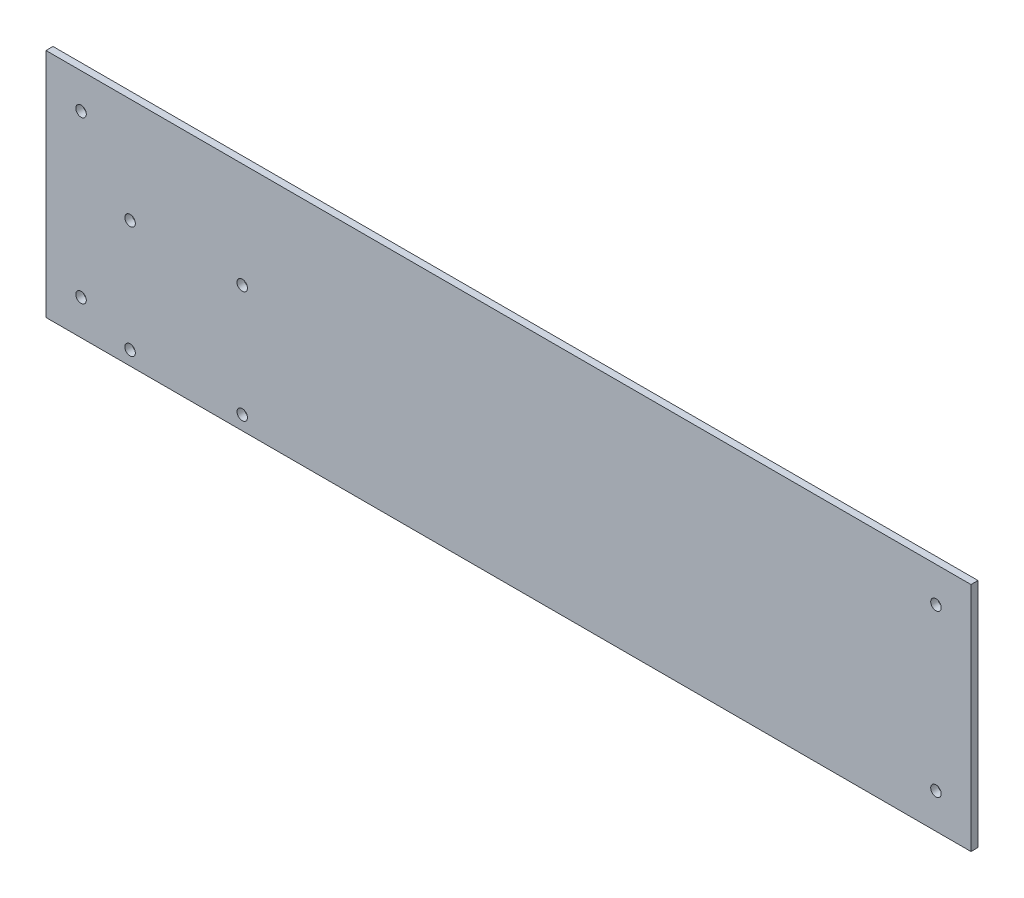
ISO-10303-21;
HEADER;
FILE_DESCRIPTION(('STEP AP214'),'2;1');
FILE_NAME('part.step','',(''),(''),'','','');
FILE_SCHEMA(('AUTOMOTIVE_DESIGN { 1 0 10303 214 1 1 1 1 }'));
ENDSEC;
DATA;
#1=APPLICATION_CONTEXT('core data for automotive mechanical design processes');
#2=APPLICATION_PROTOCOL_DEFINITION('international standard','automotive_design',2000,#1);
#3=PRODUCT_CONTEXT('',#1,'mechanical');
#4=PRODUCT('Part','Part','',(#3));
#5=PRODUCT_RELATED_PRODUCT_CATEGORY('part','',(#4));
#6=PRODUCT_DEFINITION_FORMATION('','',#4);
#7=PRODUCT_DEFINITION_CONTEXT('part definition',#1,'design');
#8=PRODUCT_DEFINITION('design','',#6,#7);
#9=PRODUCT_DEFINITION_SHAPE('','',#8);
#10=(LENGTH_UNIT() NAMED_UNIT(*) SI_UNIT(.MILLI.,.METRE.));
#11=(NAMED_UNIT(*) PLANE_ANGLE_UNIT() SI_UNIT($,.RADIAN.));
#12=(NAMED_UNIT(*) SI_UNIT($,.STERADIAN.) SOLID_ANGLE_UNIT());
#13=UNCERTAINTY_MEASURE_WITH_UNIT(LENGTH_MEASURE(1.E-05),#10,'distance_accuracy_value','');
#14=(GEOMETRIC_REPRESENTATION_CONTEXT(3) GLOBAL_UNCERTAINTY_ASSIGNED_CONTEXT((#13)) GLOBAL_UNIT_ASSIGNED_CONTEXT((#10,
#11,#12)) REPRESENTATION_CONTEXT('',''));
#15=CARTESIAN_POINT('',(0.,0.,0.));
#16=DIRECTION('',(0.,0.,1.));
#17=DIRECTION('',(1.,0.,0.));
#18=AXIS2_PLACEMENT_3D('',#15,#16,#17);
#19=CARTESIAN_POINT('',(-45.7386993125698,-13.0918085106383,2.));
#20=DIRECTION('',(0.,0.,1.));
#21=DIRECTION('',(1.,0.,0.));
#22=AXIS2_PLACEMENT_3D('',#19,#20,#21);
#23=PLANE('',#22);
#24=CARTESIAN_POINT('',(-21.7386993125698,-9.09180851063831,2.));
#25=DIRECTION('',(0.,0.,1.));
#26=DIRECTION('',(1.,0.,0.));
#27=AXIS2_PLACEMENT_3D('',#24,#25,#26);
#28=CIRCLE('',#27,1.5);
#29=CARTESIAN_POINT('',(-20.2386993125698,-9.09180851063831,2.));
#30=VERTEX_POINT('',#29);
#31=EDGE_CURVE('E126',#30,#30,#28,.T.);
#32=ORIENTED_EDGE('',*,*,#31,.F.);
#33=EDGE_LOOP('',(#32));
#34=FACE_BOUND('',#33,.T.);
#35=CARTESIAN_POINT('',(10.2613006874302,-9.0918085106383,2.));
#36=DIRECTION('',(0.,0.,1.));
#37=DIRECTION('',(1.,0.,0.));
#38=AXIS2_PLACEMENT_3D('',#35,#36,#37);
#39=CIRCLE('',#38,1.5);
#40=CARTESIAN_POINT('',(11.7613006874302,-9.0918085106383,2.));
#41=VERTEX_POINT('',#40);
#42=EDGE_CURVE('E116',#41,#41,#39,.T.);
#43=ORIENTED_EDGE('',*,*,#42,.F.);
#44=EDGE_LOOP('',(#43));
#45=FACE_BOUND('',#44,.T.);
#46=CARTESIAN_POINT('',(10.2613006874301,22.9081914893617,2.));
#47=DIRECTION('',(0.,0.,1.));
#48=DIRECTION('',(1.,0.,0.));
#49=AXIS2_PLACEMENT_3D('',#46,#47,#48);
#50=CIRCLE('',#49,1.5);
#51=CARTESIAN_POINT('',(11.7613006874302,22.9081914893617,2.));
#52=VERTEX_POINT('',#51);
#53=EDGE_CURVE('E113',#52,#52,#50,.T.);
#54=ORIENTED_EDGE('',*,*,#53,.F.);
#55=EDGE_LOOP('',(#54));
#56=FACE_BOUND('',#55,.T.);
#57=CARTESIAN_POINT('',(-21.7386993125699,22.9081914893617,2.));
#58=DIRECTION('',(0.,0.,1.));
#59=DIRECTION('',(1.,0.,0.));
#60=AXIS2_PLACEMENT_3D('',#57,#58,#59);
#61=CIRCLE('',#60,1.5);
#62=CARTESIAN_POINT('',(-20.2386993125698,22.9081914893617,2.));
#63=VERTEX_POINT('',#62);
#64=EDGE_CURVE('E110',#63,#63,#61,.T.);
#65=ORIENTED_EDGE('',*,*,#64,.F.);
#66=EDGE_LOOP('',(#65));
#67=FACE_BOUND('',#66,.T.);
#68=CARTESIAN_POINT('',(208.26130068743,42.9081914893617,2.));
#69=DIRECTION('',(0.,0.,1.));
#70=DIRECTION('',(1.,0.,0.));
#71=AXIS2_PLACEMENT_3D('',#68,#69,#70);
#72=CIRCLE('',#71,1.5);
#73=CARTESIAN_POINT('',(209.76130068743,42.9081914893617,2.));
#74=VERTEX_POINT('',#73);
#75=EDGE_CURVE('E137',#74,#74,#72,.T.);
#76=ORIENTED_EDGE('',*,*,#75,.F.);
#77=EDGE_LOOP('',(#76));
#78=FACE_BOUND('',#77,.T.);
#79=CARTESIAN_POINT('',(-35.7386993125698,42.9081914893617,2.));
#80=DIRECTION('',(0.,0.,1.));
#81=DIRECTION('',(1.,0.,0.));
#82=AXIS2_PLACEMENT_3D('',#79,#80,#81);
#83=CIRCLE('',#82,1.5);
#84=CARTESIAN_POINT('',(-34.2386993125698,42.9081914893617,2.));
#85=VERTEX_POINT('',#84);
#86=EDGE_CURVE('E100',#85,#85,#83,.T.);
#87=ORIENTED_EDGE('',*,*,#86,.F.);
#88=EDGE_LOOP('',(#87));
#89=FACE_BOUND('',#88,.T.);
#90=DIRECTION('',(0.,-1.,0.));
#91=VECTOR('',#90,1.);
#92=CARTESIAN_POINT('',(-45.7386993125698,52.9081914893617,2.));
#93=LINE('',#92,#91);
#94=CARTESIAN_POINT('',(-45.7386993125698,52.9081914893617,2.));
#95=VERTEX_POINT('',#94);
#96=CARTESIAN_POINT('',(-45.7386993125698,-13.0918085106383,2.));
#97=VERTEX_POINT('',#96);
#98=EDGE_CURVE('E84',#95,#97,#93,.T.);
#99=ORIENTED_EDGE('',*,*,#98,.T.);
#100=DIRECTION('',(1.,0.,0.));
#101=VECTOR('',#100,1.);
#102=CARTESIAN_POINT('',(-45.7386993125698,-13.0918085106383,2.));
#103=LINE('',#102,#101);
#104=CARTESIAN_POINT('',(218.26130068743,-13.0918085106383,2.));
#105=VERTEX_POINT('',#104);
#106=EDGE_CURVE('E79',#97,#105,#103,.T.);
#107=ORIENTED_EDGE('',*,*,#106,.T.);
#108=DIRECTION('',(0.,1.,0.));
#109=VECTOR('',#108,1.);
#110=CARTESIAN_POINT('',(218.26130068743,52.9081914893617,2.));
#111=LINE('',#110,#109);
#112=CARTESIAN_POINT('',(218.26130068743,52.9081914893617,2.));
#113=VERTEX_POINT('',#112);
#114=EDGE_CURVE('E82',#105,#113,#111,.T.);
#115=ORIENTED_EDGE('',*,*,#114,.T.);
#116=DIRECTION('',(-1.,0.,0.));
#117=VECTOR('',#116,1.);
#118=CARTESIAN_POINT('',(-45.7386993125698,52.9081914893617,2.));
#119=LINE('',#118,#117);
#120=EDGE_CURVE('E49',#113,#95,#119,.T.);
#121=ORIENTED_EDGE('',*,*,#120,.T.);
#122=EDGE_LOOP('',(#99,#107,#115,#121));
#123=FACE_BOUND('',#122,.T.);
#124=CARTESIAN_POINT('',(-35.7386993125698,-3.09180851063831,2.));
#125=DIRECTION('',(0.,0.,1.));
#126=DIRECTION('',(1.,0.,0.));
#127=AXIS2_PLACEMENT_3D('',#124,#125,#126);
#128=CIRCLE('',#127,1.5);
#129=CARTESIAN_POINT('',(-34.2386993125698,-3.09180851063831,2.));
#130=VERTEX_POINT('',#129);
#131=EDGE_CURVE('E143',#130,#130,#128,.T.);
#132=ORIENTED_EDGE('',*,*,#131,.F.);
#133=EDGE_LOOP('',(#132));
#134=FACE_BOUND('',#133,.T.);
#135=CARTESIAN_POINT('',(208.26130068743,-3.09180851063831,2.));
#136=DIRECTION('',(0.,0.,1.));
#137=DIRECTION('',(1.,0.,0.));
#138=AXIS2_PLACEMENT_3D('',#135,#136,#137);
#139=CIRCLE('',#138,1.5);
#140=CARTESIAN_POINT('',(209.76130068743,-3.09180851063831,2.));
#141=VERTEX_POINT('',#140);
#142=EDGE_CURVE('E131',#141,#141,#139,.T.);
#143=ORIENTED_EDGE('',*,*,#142,.F.);
#144=EDGE_LOOP('',(#143));
#145=FACE_BOUND('',#144,.T.);
#146=ADVANCED_FACE('F30',(#34,#45,#56,#67,#78,#89,#123,#134,#145),#23,.T.);
#147=CARTESIAN_POINT('',(-45.7386993125698,-13.0918085106383,0.));
#148=DIRECTION('',(0.,0.,1.));
#149=DIRECTION('',(1.,0.,0.));
#150=AXIS2_PLACEMENT_3D('',#147,#148,#149);
#151=PLANE('',#150);
#152=CARTESIAN_POINT('',(-21.7386993125698,-9.09180851063831,0.));
#153=DIRECTION('',(0.,0.,1.));
#154=DIRECTION('',(1.,0.,0.));
#155=AXIS2_PLACEMENT_3D('',#152,#153,#154);
#156=CIRCLE('',#155,1.5);
#157=CARTESIAN_POINT('',(-20.2386993125698,-9.09180851063831,0.));
#158=VERTEX_POINT('',#157);
#159=EDGE_CURVE('E34',#158,#158,#156,.T.);
#160=ORIENTED_EDGE('',*,*,#159,.T.);
#161=EDGE_LOOP('',(#160));
#162=FACE_BOUND('',#161,.T.);
#163=CARTESIAN_POINT('',(10.2613006874302,-9.0918085106383,0.));
#164=DIRECTION('',(0.,0.,1.));
#165=DIRECTION('',(1.,0.,0.));
#166=AXIS2_PLACEMENT_3D('',#163,#164,#165);
#167=CIRCLE('',#166,1.5);
#168=CARTESIAN_POINT('',(11.7613006874302,-9.0918085106383,0.));
#169=VERTEX_POINT('',#168);
#170=EDGE_CURVE('E114',#169,#169,#167,.T.);
#171=ORIENTED_EDGE('',*,*,#170,.T.);
#172=EDGE_LOOP('',(#171));
#173=FACE_BOUND('',#172,.T.);
#174=CARTESIAN_POINT('',(10.2613006874301,22.9081914893617,0.));
#175=DIRECTION('',(0.,0.,1.));
#176=DIRECTION('',(1.,0.,0.));
#177=AXIS2_PLACEMENT_3D('',#174,#175,#176);
#178=CIRCLE('',#177,1.5);
#179=CARTESIAN_POINT('',(11.7613006874302,22.9081914893617,0.));
#180=VERTEX_POINT('',#179);
#181=EDGE_CURVE('E111',#180,#180,#178,.T.);
#182=ORIENTED_EDGE('',*,*,#181,.T.);
#183=EDGE_LOOP('',(#182));
#184=FACE_BOUND('',#183,.T.);
#185=CARTESIAN_POINT('',(-21.7386993125699,22.9081914893617,0.));
#186=DIRECTION('',(0.,0.,1.));
#187=DIRECTION('',(1.,0.,0.));
#188=AXIS2_PLACEMENT_3D('',#185,#186,#187);
#189=CIRCLE('',#188,1.5);
#190=CARTESIAN_POINT('',(-20.2386993125698,22.9081914893617,0.));
#191=VERTEX_POINT('',#190);
#192=EDGE_CURVE('E106',#191,#191,#189,.T.);
#193=ORIENTED_EDGE('',*,*,#192,.T.);
#194=EDGE_LOOP('',(#193));
#195=FACE_BOUND('',#194,.T.);
#196=CARTESIAN_POINT('',(208.26130068743,42.9081914893617,0.));
#197=DIRECTION('',(0.,0.,1.));
#198=DIRECTION('',(1.,0.,0.));
#199=AXIS2_PLACEMENT_3D('',#196,#197,#198);
#200=CIRCLE('',#199,1.5);
#201=CARTESIAN_POINT('',(209.76130068743,42.9081914893617,0.));
#202=VERTEX_POINT('',#201);
#203=EDGE_CURVE('E134',#202,#202,#200,.T.);
#204=ORIENTED_EDGE('',*,*,#203,.T.);
#205=EDGE_LOOP('',(#204));
#206=FACE_BOUND('',#205,.T.);
#207=CARTESIAN_POINT('',(-35.7386993125698,42.9081914893617,0.));
#208=DIRECTION('',(0.,0.,1.));
#209=DIRECTION('',(1.,0.,0.));
#210=AXIS2_PLACEMENT_3D('',#207,#208,#209);
#211=CIRCLE('',#210,1.5);
#212=CARTESIAN_POINT('',(-34.2386993125698,42.9081914893617,0.));
#213=VERTEX_POINT('',#212);
#214=EDGE_CURVE('E146',#213,#213,#211,.T.);
#215=ORIENTED_EDGE('',*,*,#214,.T.);
#216=EDGE_LOOP('',(#215));
#217=FACE_BOUND('',#216,.T.);
#218=DIRECTION('',(0.,-1.,0.));
#219=VECTOR('',#218,1.);
#220=CARTESIAN_POINT('',(-45.7386993125698,52.9081914893617,0.));
#221=LINE('',#220,#219);
#222=CARTESIAN_POINT('',(-45.7386993125698,52.9081914893617,0.));
#223=VERTEX_POINT('',#222);
#224=CARTESIAN_POINT('',(-45.7386993125698,-13.0918085106383,0.));
#225=VERTEX_POINT('',#224);
#226=EDGE_CURVE('E97',#223,#225,#221,.T.);
#227=ORIENTED_EDGE('',*,*,#226,.F.);
#228=DIRECTION('',(-1.,0.,0.));
#229=VECTOR('',#228,1.);
#230=CARTESIAN_POINT('',(-45.7386993125698,52.9081914893617,0.));
#231=LINE('',#230,#229);
#232=CARTESIAN_POINT('',(218.26130068743,52.9081914893617,0.));
#233=VERTEX_POINT('',#232);
#234=EDGE_CURVE('E72',#233,#223,#231,.T.);
#235=ORIENTED_EDGE('',*,*,#234,.F.);
#236=DIRECTION('',(0.,1.,0.));
#237=VECTOR('',#236,1.);
#238=CARTESIAN_POINT('',(218.26130068743,52.9081914893617,0.));
#239=LINE('',#238,#237);
#240=CARTESIAN_POINT('',(218.26130068743,-13.0918085106383,0.));
#241=VERTEX_POINT('',#240);
#242=EDGE_CURVE('E66',#241,#233,#239,.T.);
#243=ORIENTED_EDGE('',*,*,#242,.F.);
#244=DIRECTION('',(1.,0.,0.));
#245=VECTOR('',#244,1.);
#246=CARTESIAN_POINT('',(-45.7386993125698,-13.0918085106383,0.));
#247=LINE('',#246,#245);
#248=EDGE_CURVE('E88',#225,#241,#247,.T.);
#249=ORIENTED_EDGE('',*,*,#248,.F.);
#250=EDGE_LOOP('',(#227,#235,#243,#249));
#251=FACE_BOUND('',#250,.T.);
#252=CARTESIAN_POINT('',(-35.7386993125698,-3.09180851063831,0.));
#253=DIRECTION('',(0.,0.,1.));
#254=DIRECTION('',(1.,0.,0.));
#255=AXIS2_PLACEMENT_3D('',#252,#253,#254);
#256=CIRCLE('',#255,1.5);
#257=CARTESIAN_POINT('',(-34.2386993125698,-3.09180851063831,0.));
#258=VERTEX_POINT('',#257);
#259=EDGE_CURVE('E140',#258,#258,#256,.T.);
#260=ORIENTED_EDGE('',*,*,#259,.T.);
#261=EDGE_LOOP('',(#260));
#262=FACE_BOUND('',#261,.T.);
#263=CARTESIAN_POINT('',(208.26130068743,-3.09180851063831,0.));
#264=DIRECTION('',(0.,0.,1.));
#265=DIRECTION('',(1.,0.,0.));
#266=AXIS2_PLACEMENT_3D('',#263,#264,#265);
#267=CIRCLE('',#266,1.5);
#268=CARTESIAN_POINT('',(209.76130068743,-3.09180851063831,0.));
#269=VERTEX_POINT('',#268);
#270=EDGE_CURVE('E109',#269,#269,#267,.T.);
#271=ORIENTED_EDGE('',*,*,#270,.T.);
#272=EDGE_LOOP('',(#271));
#273=FACE_BOUND('',#272,.T.);
#274=ADVANCED_FACE('F154',(#162,#173,#184,#195,#206,#217,#251,#262,#273),#151,.F.);
#275=CARTESIAN_POINT('',(-45.7386993125698,52.9081914893617,2.));
#276=DIRECTION('',(1.,0.,0.));
#277=DIRECTION('',(0.,0.,-1.));
#278=AXIS2_PLACEMENT_3D('',#275,#276,#277);
#279=PLANE('',#278);
#280=ORIENTED_EDGE('',*,*,#226,.T.);
#281=DIRECTION('',(0.,0.,-1.));
#282=VECTOR('',#281,1.);
#283=CARTESIAN_POINT('',(-45.7386993125698,-13.0918085106383,2.));
#284=LINE('',#283,#282);
#285=EDGE_CURVE('E11',#97,#225,#284,.T.);
#286=ORIENTED_EDGE('',*,*,#285,.F.);
#287=ORIENTED_EDGE('',*,*,#98,.F.);
#288=DIRECTION('',(0.,0.,-1.));
#289=VECTOR('',#288,1.);
#290=CARTESIAN_POINT('',(-45.7386993125698,52.9081914893617,2.));
#291=LINE('',#290,#289);
#292=EDGE_CURVE('E93',#95,#223,#291,.T.);
#293=ORIENTED_EDGE('',*,*,#292,.T.);
#294=EDGE_LOOP('',(#280,#286,#287,#293));
#295=FACE_BOUND('',#294,.T.);
#296=ADVANCED_FACE('F32',(#295),#279,.F.);
#297=CARTESIAN_POINT('',(-45.7386993125698,-13.0918085106383,2.));
#298=DIRECTION('',(0.,1.,0.));
#299=DIRECTION('',(0.,0.,1.));
#300=AXIS2_PLACEMENT_3D('',#297,#298,#299);
#301=PLANE('',#300);
#302=ORIENTED_EDGE('',*,*,#248,.T.);
#303=DIRECTION('',(0.,0.,-1.));
#304=VECTOR('',#303,1.);
#305=CARTESIAN_POINT('',(218.26130068743,-13.0918085106383,2.));
#306=LINE('',#305,#304);
#307=EDGE_CURVE('E40',#105,#241,#306,.T.);
#308=ORIENTED_EDGE('',*,*,#307,.F.);
#309=ORIENTED_EDGE('',*,*,#106,.F.);
#310=ORIENTED_EDGE('',*,*,#285,.T.);
#311=EDGE_LOOP('',(#302,#308,#309,#310));
#312=FACE_BOUND('',#311,.T.);
#313=ADVANCED_FACE('F87',(#312),#301,.F.);
#314=CARTESIAN_POINT('',(218.26130068743,52.9081914893617,2.));
#315=DIRECTION('',(-1.,0.,0.));
#316=DIRECTION('',(0.,0.,1.));
#317=AXIS2_PLACEMENT_3D('',#314,#315,#316);
#318=PLANE('',#317);
#319=ORIENTED_EDGE('',*,*,#242,.T.);
#320=DIRECTION('',(0.,0.,-1.));
#321=VECTOR('',#320,1.);
#322=CARTESIAN_POINT('',(218.26130068743,52.9081914893617,2.));
#323=LINE('',#322,#321);
#324=EDGE_CURVE('E89',#113,#233,#323,.T.);
#325=ORIENTED_EDGE('',*,*,#324,.F.);
#326=ORIENTED_EDGE('',*,*,#114,.F.);
#327=ORIENTED_EDGE('',*,*,#307,.T.);
#328=EDGE_LOOP('',(#319,#325,#326,#327));
#329=FACE_BOUND('',#328,.T.);
#330=ADVANCED_FACE('F91',(#329),#318,.F.);
#331=CARTESIAN_POINT('',(-45.7386993125698,52.9081914893617,2.));
#332=DIRECTION('',(0.,-1.,0.));
#333=DIRECTION('',(0.,0.,-1.));
#334=AXIS2_PLACEMENT_3D('',#331,#332,#333);
#335=PLANE('',#334);
#336=ORIENTED_EDGE('',*,*,#234,.T.);
#337=ORIENTED_EDGE('',*,*,#292,.F.);
#338=ORIENTED_EDGE('',*,*,#120,.F.);
#339=ORIENTED_EDGE('',*,*,#324,.T.);
#340=EDGE_LOOP('',(#336,#337,#338,#339));
#341=FACE_BOUND('',#340,.T.);
#342=ADVANCED_FACE('F160',(#341),#335,.F.);
#343=CARTESIAN_POINT('',(-35.7386993125698,42.9081914893617,2.));
#344=DIRECTION('',(0.,0.,-1.));
#345=DIRECTION('',(-1.,0.,0.));
#346=AXIS2_PLACEMENT_3D('',#343,#344,#345);
#347=CYLINDRICAL_SURFACE('',#346,1.5);
#348=ORIENTED_EDGE('',*,*,#86,.T.);
#349=EDGE_LOOP('',(#348));
#350=FACE_BOUND('',#349,.T.);
#351=ORIENTED_EDGE('',*,*,#214,.F.);
#352=EDGE_LOOP('',(#351));
#353=FACE_BOUND('',#352,.T.);
#354=ADVANCED_FACE('F157',(#350,#353),#347,.F.);
#355=CARTESIAN_POINT('',(-35.7386993125698,-3.09180851063831,2.));
#356=DIRECTION('',(0.,0.,-1.));
#357=DIRECTION('',(-1.,0.,0.));
#358=AXIS2_PLACEMENT_3D('',#355,#356,#357);
#359=CYLINDRICAL_SURFACE('',#358,1.5);
#360=ORIENTED_EDGE('',*,*,#131,.T.);
#361=EDGE_LOOP('',(#360));
#362=FACE_BOUND('',#361,.T.);
#363=ORIENTED_EDGE('',*,*,#259,.F.);
#364=EDGE_LOOP('',(#363));
#365=FACE_BOUND('',#364,.T.);
#366=ADVANCED_FACE('F159',(#362,#365),#359,.F.);
#367=CARTESIAN_POINT('',(208.26130068743,42.9081914893617,2.));
#368=DIRECTION('',(0.,0.,-1.));
#369=DIRECTION('',(-1.,0.,0.));
#370=AXIS2_PLACEMENT_3D('',#367,#368,#369);
#371=CYLINDRICAL_SURFACE('',#370,1.5);
#372=ORIENTED_EDGE('',*,*,#75,.T.);
#373=EDGE_LOOP('',(#372));
#374=FACE_BOUND('',#373,.T.);
#375=ORIENTED_EDGE('',*,*,#203,.F.);
#376=EDGE_LOOP('',(#375));
#377=FACE_BOUND('',#376,.T.);
#378=ADVANCED_FACE('F167',(#374,#377),#371,.F.);
#379=CARTESIAN_POINT('',(208.26130068743,-3.09180851063831,2.));
#380=DIRECTION('',(0.,0.,-1.));
#381=DIRECTION('',(-1.,0.,0.));
#382=AXIS2_PLACEMENT_3D('',#379,#380,#381);
#383=CYLINDRICAL_SURFACE('',#382,1.5);
#384=ORIENTED_EDGE('',*,*,#142,.T.);
#385=EDGE_LOOP('',(#384));
#386=FACE_BOUND('',#385,.T.);
#387=ORIENTED_EDGE('',*,*,#270,.F.);
#388=EDGE_LOOP('',(#387));
#389=FACE_BOUND('',#388,.T.);
#390=ADVANCED_FACE('F196',(#386,#389),#383,.F.);
#391=CARTESIAN_POINT('',(-21.7386993125699,22.9081914893617,-8.));
#392=DIRECTION('',(0.,0.,1.));
#393=DIRECTION('',(1.,0.,0.));
#394=AXIS2_PLACEMENT_3D('',#391,#392,#393);
#395=CYLINDRICAL_SURFACE('',#394,1.5);
#396=ORIENTED_EDGE('',*,*,#64,.T.);
#397=EDGE_LOOP('',(#396));
#398=FACE_BOUND('',#397,.T.);
#399=ORIENTED_EDGE('',*,*,#192,.F.);
#400=EDGE_LOOP('',(#399));
#401=FACE_BOUND('',#400,.T.);
#402=ADVANCED_FACE('F198',(#398,#401),#395,.F.);
#403=CARTESIAN_POINT('',(10.2613006874301,22.9081914893617,-8.));
#404=DIRECTION('',(0.,0.,1.));
#405=DIRECTION('',(1.,0.,0.));
#406=AXIS2_PLACEMENT_3D('',#403,#404,#405);
#407=CYLINDRICAL_SURFACE('',#406,1.5);
#408=ORIENTED_EDGE('',*,*,#53,.T.);
#409=EDGE_LOOP('',(#408));
#410=FACE_BOUND('',#409,.T.);
#411=ORIENTED_EDGE('',*,*,#181,.F.);
#412=EDGE_LOOP('',(#411));
#413=FACE_BOUND('',#412,.T.);
#414=ADVANCED_FACE('F205',(#410,#413),#407,.F.);
#415=CARTESIAN_POINT('',(10.2613006874302,-9.0918085106383,-8.));
#416=DIRECTION('',(0.,0.,1.));
#417=DIRECTION('',(1.,0.,0.));
#418=AXIS2_PLACEMENT_3D('',#415,#416,#417);
#419=CYLINDRICAL_SURFACE('',#418,1.5);
#420=ORIENTED_EDGE('',*,*,#42,.T.);
#421=EDGE_LOOP('',(#420));
#422=FACE_BOUND('',#421,.T.);
#423=ORIENTED_EDGE('',*,*,#170,.F.);
#424=EDGE_LOOP('',(#423));
#425=FACE_BOUND('',#424,.T.);
#426=ADVANCED_FACE('F213',(#422,#425),#419,.F.);
#427=CARTESIAN_POINT('',(-21.7386993125698,-9.09180851063831,-8.));
#428=DIRECTION('',(0.,0.,1.));
#429=DIRECTION('',(1.,0.,0.));
#430=AXIS2_PLACEMENT_3D('',#427,#428,#429);
#431=CYLINDRICAL_SURFACE('',#430,1.5);
#432=ORIENTED_EDGE('',*,*,#31,.T.);
#433=EDGE_LOOP('',(#432));
#434=FACE_BOUND('',#433,.T.);
#435=ORIENTED_EDGE('',*,*,#159,.F.);
#436=EDGE_LOOP('',(#435));
#437=FACE_BOUND('',#436,.T.);
#438=ADVANCED_FACE('F217',(#434,#437),#431,.F.);
#439=CLOSED_SHELL('',(#146,#274,#296,#313,#330,#342,#354,#366,#378,#390,#402,#414,#426,#438));
#440=MANIFOLD_SOLID_BREP('B2',#439);
#441=ADVANCED_BREP_SHAPE_REPRESENTATION('',(#18,#440),#14);
#442=SHAPE_DEFINITION_REPRESENTATION(#9,#441);
ENDSEC;
END-ISO-10303-21;
